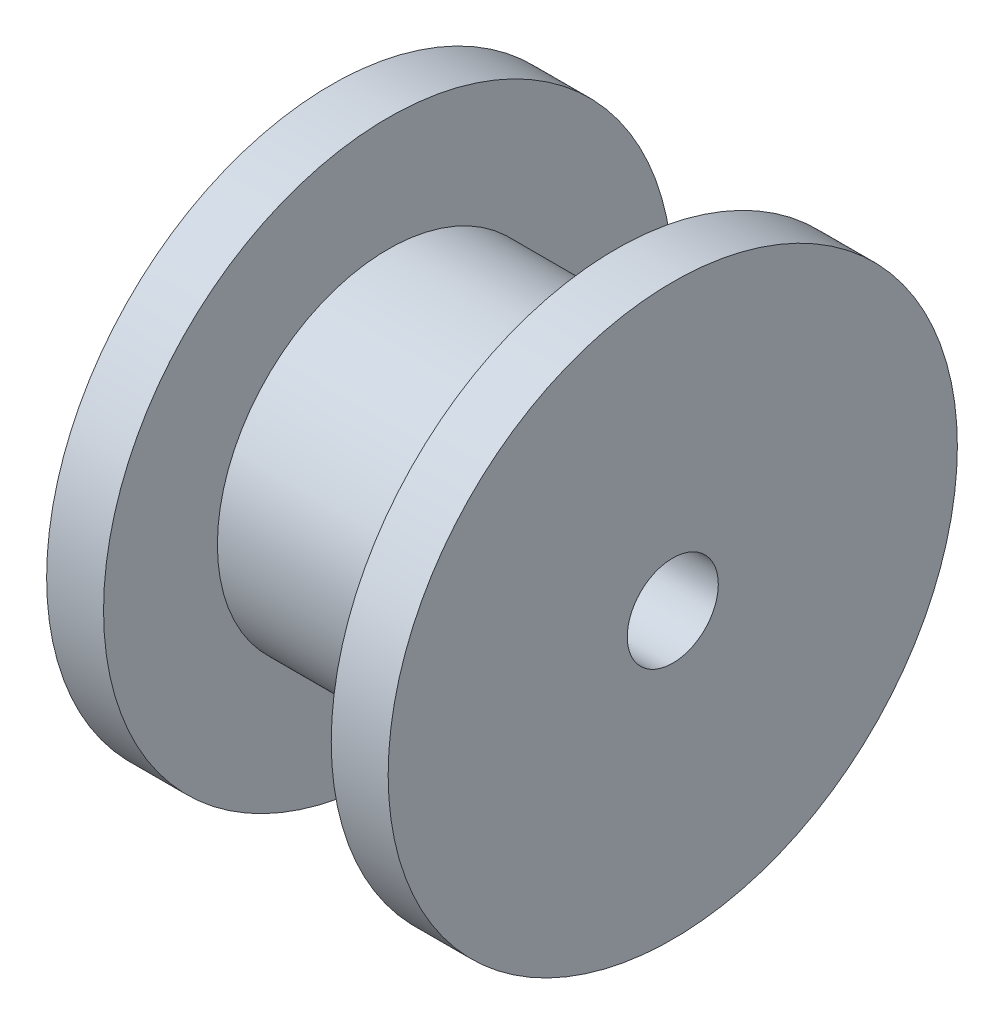
ISO-10303-21;
HEADER;
FILE_DESCRIPTION(('STEP AP214'),'2;1');
FILE_NAME('part.step','',(''),(''),'','','');
FILE_SCHEMA(('AUTOMOTIVE_DESIGN { 1 0 10303 214 1 1 1 1 }'));
ENDSEC;
DATA;
#1=APPLICATION_CONTEXT('core data for automotive mechanical design processes');
#2=APPLICATION_PROTOCOL_DEFINITION('international standard','automotive_design',2000,#1);
#3=PRODUCT_CONTEXT('',#1,'mechanical');
#4=PRODUCT('Part','Part','',(#3));
#5=PRODUCT_RELATED_PRODUCT_CATEGORY('part','',(#4));
#6=PRODUCT_DEFINITION_FORMATION('','',#4);
#7=PRODUCT_DEFINITION_CONTEXT('part definition',#1,'design');
#8=PRODUCT_DEFINITION('design','',#6,#7);
#9=PRODUCT_DEFINITION_SHAPE('','',#8);
#10=(LENGTH_UNIT() NAMED_UNIT(*) SI_UNIT(.MILLI.,.METRE.));
#11=(NAMED_UNIT(*) PLANE_ANGLE_UNIT() SI_UNIT($,.RADIAN.));
#12=(NAMED_UNIT(*) SI_UNIT($,.STERADIAN.) SOLID_ANGLE_UNIT());
#13=UNCERTAINTY_MEASURE_WITH_UNIT(LENGTH_MEASURE(1.E-05),#10,'distance_accuracy_value','');
#14=(GEOMETRIC_REPRESENTATION_CONTEXT(3) GLOBAL_UNCERTAINTY_ASSIGNED_CONTEXT((#13)) GLOBAL_UNIT_ASSIGNED_CONTEXT((#10,
#11,#12)) REPRESENTATION_CONTEXT('',''));
#15=CARTESIAN_POINT('',(0.,0.,0.));
#16=DIRECTION('',(0.,0.,1.));
#17=DIRECTION('',(1.,0.,0.));
#18=AXIS2_PLACEMENT_3D('',#15,#16,#17);
#19=CARTESIAN_POINT('',(2.,0.,0.));
#20=DIRECTION('',(-1.,0.,0.));
#21=DIRECTION('',(0.,0.,1.));
#22=AXIS2_PLACEMENT_3D('',#19,#20,#21);
#23=CYLINDRICAL_SURFACE('',#22,10.);
#24=CARTESIAN_POINT('',(2.,0.,0.));
#25=DIRECTION('',(1.,0.,0.));
#26=DIRECTION('',(0.,0.,-1.));
#27=AXIS2_PLACEMENT_3D('',#24,#25,#26);
#28=CIRCLE('',#27,10.);
#29=CARTESIAN_POINT('',(2.,0.,-10.));
#30=VERTEX_POINT('',#29);
#31=EDGE_CURVE('E10',#30,#30,#28,.T.);
#32=ORIENTED_EDGE('',*,*,#31,.F.);
#33=EDGE_LOOP('',(#32));
#34=FACE_BOUND('',#33,.T.);
#35=CARTESIAN_POINT('',(0.,0.,0.));
#36=DIRECTION('',(1.,0.,0.));
#37=DIRECTION('',(0.,0.,-1.));
#38=AXIS2_PLACEMENT_3D('',#35,#36,#37);
#39=CIRCLE('',#38,10.);
#40=CARTESIAN_POINT('',(0.,0.,-10.));
#41=VERTEX_POINT('',#40);
#42=EDGE_CURVE('E36',#41,#41,#39,.T.);
#43=ORIENTED_EDGE('',*,*,#42,.T.);
#44=EDGE_LOOP('',(#43));
#45=FACE_BOUND('',#44,.T.);
#46=ADVANCED_FACE('F33',(#34,#45),#23,.T.);
#47=CARTESIAN_POINT('',(2.,0.,0.));
#48=DIRECTION('',(1.,0.,0.));
#49=DIRECTION('',(0.,0.,-1.));
#50=AXIS2_PLACEMENT_3D('',#47,#48,#49);
#51=PLANE('',#50);
#52=CARTESIAN_POINT('',(2.,0.,0.));
#53=DIRECTION('',(1.,0.,0.));
#54=DIRECTION('',(0.,0.,-1.));
#55=AXIS2_PLACEMENT_3D('',#52,#53,#54);
#56=CIRCLE('',#55,6.);
#57=CARTESIAN_POINT('',(2.,0.,-6.));
#58=VERTEX_POINT('',#57);
#59=EDGE_CURVE('E45',#58,#58,#56,.T.);
#60=ORIENTED_EDGE('',*,*,#59,.F.);
#61=EDGE_LOOP('',(#60));
#62=FACE_BOUND('',#61,.T.);
#63=ORIENTED_EDGE('',*,*,#31,.T.);
#64=EDGE_LOOP('',(#63));
#65=FACE_BOUND('',#64,.T.);
#66=ADVANCED_FACE('F92',(#62,#65),#51,.T.);
#67=CARTESIAN_POINT('',(0.,0.,0.));
#68=DIRECTION('',(1.,0.,0.));
#69=DIRECTION('',(0.,0.,-1.));
#70=AXIS2_PLACEMENT_3D('',#67,#68,#69);
#71=PLANE('',#70);
#72=CARTESIAN_POINT('',(0.,0.,0.));
#73=DIRECTION('',(1.,0.,0.));
#74=DIRECTION('',(0.,0.,-1.));
#75=AXIS2_PLACEMENT_3D('',#72,#73,#74);
#76=CIRCLE('',#75,1.6);
#77=CARTESIAN_POINT('',(0.,0.,-1.6));
#78=VERTEX_POINT('',#77);
#79=EDGE_CURVE('E54',#78,#78,#76,.T.);
#80=ORIENTED_EDGE('',*,*,#79,.T.);
#81=EDGE_LOOP('',(#80));
#82=FACE_BOUND('',#81,.T.);
#83=ORIENTED_EDGE('',*,*,#42,.F.);
#84=EDGE_LOOP('',(#83));
#85=FACE_BOUND('',#84,.T.);
#86=ADVANCED_FACE('F63',(#82,#85),#71,.F.);
#87=CARTESIAN_POINT('',(10.,0.,0.));
#88=DIRECTION('',(-1.,0.,0.));
#89=DIRECTION('',(0.,0.,1.));
#90=AXIS2_PLACEMENT_3D('',#87,#88,#89);
#91=CYLINDRICAL_SURFACE('',#90,6.);
#92=CARTESIAN_POINT('',(10.,0.,0.));
#93=DIRECTION('',(1.,0.,0.));
#94=DIRECTION('',(0.,0.,-1.));
#95=AXIS2_PLACEMENT_3D('',#92,#93,#94);
#96=CIRCLE('',#95,6.);
#97=CARTESIAN_POINT('',(10.,0.,-6.));
#98=VERTEX_POINT('',#97);
#99=EDGE_CURVE('E43',#98,#98,#96,.T.);
#100=ORIENTED_EDGE('',*,*,#99,.F.);
#101=EDGE_LOOP('',(#100));
#102=FACE_BOUND('',#101,.T.);
#103=ORIENTED_EDGE('',*,*,#59,.T.);
#104=EDGE_LOOP('',(#103));
#105=FACE_BOUND('',#104,.T.);
#106=ADVANCED_FACE('F82',(#102,#105),#91,.T.);
#107=CARTESIAN_POINT('',(12.,0.,0.));
#108=DIRECTION('',(-1.,0.,0.));
#109=DIRECTION('',(0.,0.,1.));
#110=AXIS2_PLACEMENT_3D('',#107,#108,#109);
#111=CYLINDRICAL_SURFACE('',#110,10.);
#112=CARTESIAN_POINT('',(12.,0.,0.));
#113=DIRECTION('',(1.,0.,0.));
#114=DIRECTION('',(0.,0.,-1.));
#115=AXIS2_PLACEMENT_3D('',#112,#113,#114);
#116=CIRCLE('',#115,10.);
#117=CARTESIAN_POINT('',(12.,0.,-10.));
#118=VERTEX_POINT('',#117);
#119=EDGE_CURVE('E48',#118,#118,#116,.T.);
#120=ORIENTED_EDGE('',*,*,#119,.F.);
#121=EDGE_LOOP('',(#120));
#122=FACE_BOUND('',#121,.T.);
#123=CARTESIAN_POINT('',(10.,0.,0.));
#124=DIRECTION('',(1.,0.,0.));
#125=DIRECTION('',(0.,0.,-1.));
#126=AXIS2_PLACEMENT_3D('',#123,#124,#125);
#127=CIRCLE('',#126,10.);
#128=CARTESIAN_POINT('',(10.,0.,-10.));
#129=VERTEX_POINT('',#128);
#130=EDGE_CURVE('E51',#129,#129,#127,.T.);
#131=ORIENTED_EDGE('',*,*,#130,.T.);
#132=EDGE_LOOP('',(#131));
#133=FACE_BOUND('',#132,.T.);
#134=ADVANCED_FACE('F76',(#122,#133),#111,.T.);
#135=CARTESIAN_POINT('',(12.,0.,0.));
#136=DIRECTION('',(1.,0.,0.));
#137=DIRECTION('',(0.,0.,-1.));
#138=AXIS2_PLACEMENT_3D('',#135,#136,#137);
#139=PLANE('',#138);
#140=CARTESIAN_POINT('',(12.,0.,0.));
#141=DIRECTION('',(1.,0.,0.));
#142=DIRECTION('',(0.,0.,-1.));
#143=AXIS2_PLACEMENT_3D('',#140,#141,#142);
#144=CIRCLE('',#143,1.6);
#145=CARTESIAN_POINT('',(12.,0.,-1.6));
#146=VERTEX_POINT('',#145);
#147=EDGE_CURVE('E57',#146,#146,#144,.T.);
#148=ORIENTED_EDGE('',*,*,#147,.F.);
#149=EDGE_LOOP('',(#148));
#150=FACE_BOUND('',#149,.T.);
#151=ORIENTED_EDGE('',*,*,#119,.T.);
#152=EDGE_LOOP('',(#151));
#153=FACE_BOUND('',#152,.T.);
#154=ADVANCED_FACE('F73',(#150,#153),#139,.T.);
#155=CARTESIAN_POINT('',(10.,0.,0.));
#156=DIRECTION('',(1.,0.,0.));
#157=DIRECTION('',(0.,0.,-1.));
#158=AXIS2_PLACEMENT_3D('',#155,#156,#157);
#159=PLANE('',#158);
#160=ORIENTED_EDGE('',*,*,#99,.T.);
#161=EDGE_LOOP('',(#160));
#162=FACE_BOUND('',#161,.T.);
#163=ORIENTED_EDGE('',*,*,#130,.F.);
#164=EDGE_LOOP('',(#163));
#165=FACE_BOUND('',#164,.T.);
#166=ADVANCED_FACE('F69',(#162,#165),#159,.F.);
#167=CARTESIAN_POINT('',(0.,0.,0.));
#168=DIRECTION('',(1.,0.,0.));
#169=DIRECTION('',(0.,0.,-1.));
#170=AXIS2_PLACEMENT_3D('',#167,#168,#169);
#171=CYLINDRICAL_SURFACE('',#170,1.6);
#172=ORIENTED_EDGE('',*,*,#79,.F.);
#173=EDGE_LOOP('',(#172));
#174=FACE_BOUND('',#173,.T.);
#175=ORIENTED_EDGE('',*,*,#147,.T.);
#176=EDGE_LOOP('',(#175));
#177=FACE_BOUND('',#176,.T.);
#178=ADVANCED_FACE('F66',(#174,#177),#171,.F.);
#179=CLOSED_SHELL('',(#46,#66,#86,#106,#134,#154,#166,#178));
#180=MANIFOLD_SOLID_BREP('B2',#179);
#181=ADVANCED_BREP_SHAPE_REPRESENTATION('',(#18,#180),#14);
#182=SHAPE_DEFINITION_REPRESENTATION(#9,#181);
ENDSEC;
END-ISO-10303-21;
